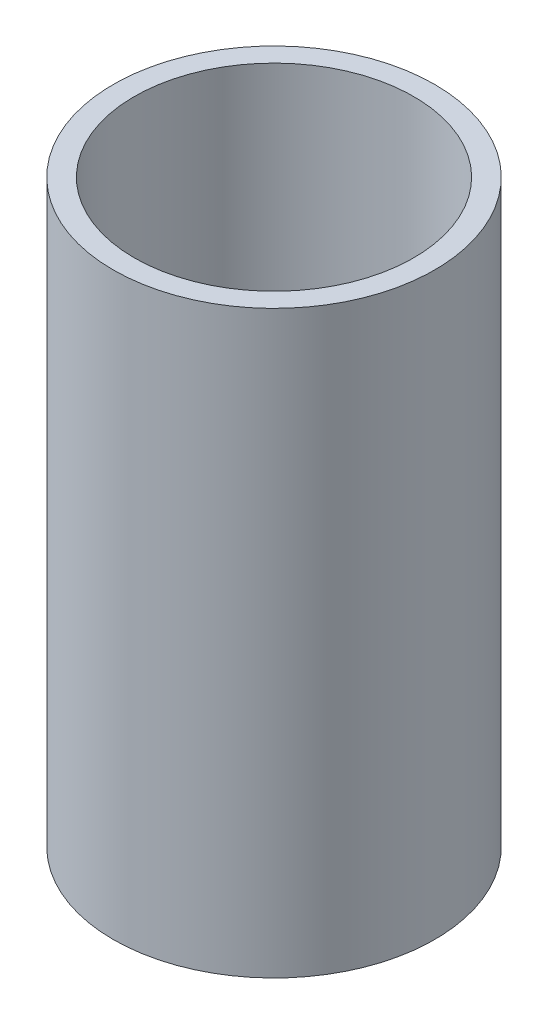
ISO-10303-21;
HEADER;
FILE_DESCRIPTION(('STEP AP214'),'2;1');
FILE_NAME('part.step','',(''),(''),'','','');
FILE_SCHEMA(('AUTOMOTIVE_DESIGN { 1 0 10303 214 1 1 1 1 }'));
ENDSEC;
DATA;
#1=APPLICATION_CONTEXT('core data for automotive mechanical design processes');
#2=APPLICATION_PROTOCOL_DEFINITION('international standard','automotive_design',2000,#1);
#3=PRODUCT_CONTEXT('',#1,'mechanical');
#4=PRODUCT('Part','Part','',(#3));
#5=PRODUCT_RELATED_PRODUCT_CATEGORY('part','',(#4));
#6=PRODUCT_DEFINITION_FORMATION('','',#4);
#7=PRODUCT_DEFINITION_CONTEXT('part definition',#1,'design');
#8=PRODUCT_DEFINITION('design','',#6,#7);
#9=PRODUCT_DEFINITION_SHAPE('','',#8);
#10=(LENGTH_UNIT() NAMED_UNIT(*) SI_UNIT(.MILLI.,.METRE.));
#11=(NAMED_UNIT(*) PLANE_ANGLE_UNIT() SI_UNIT($,.RADIAN.));
#12=(NAMED_UNIT(*) SI_UNIT($,.STERADIAN.) SOLID_ANGLE_UNIT());
#13=UNCERTAINTY_MEASURE_WITH_UNIT(LENGTH_MEASURE(1.E-05),#10,'distance_accuracy_value','');
#14=(GEOMETRIC_REPRESENTATION_CONTEXT(3) GLOBAL_UNCERTAINTY_ASSIGNED_CONTEXT((#13)) GLOBAL_UNIT_ASSIGNED_CONTEXT((#10,
#11,#12)) REPRESENTATION_CONTEXT('',''));
#15=CARTESIAN_POINT('',(0.,0.,0.));
#16=DIRECTION('',(0.,0.,1.));
#17=DIRECTION('',(1.,0.,0.));
#18=AXIS2_PLACEMENT_3D('',#15,#16,#17);
#19=CARTESIAN_POINT('',(0.,40.,0.));
#20=DIRECTION('',(0.,1.,0.));
#21=DIRECTION('',(0.,0.,1.));
#22=AXIS2_PLACEMENT_3D('',#19,#20,#21);
#23=PLANE('',#22);
#24=CARTESIAN_POINT('',(0.,40.,0.));
#25=DIRECTION('',(0.,1.,0.));
#26=DIRECTION('',(0.,0.,1.));
#27=AXIS2_PLACEMENT_3D('',#24,#25,#26);
#28=CIRCLE('',#27,11.5);
#29=CARTESIAN_POINT('',(0.,40.,11.5));
#30=VERTEX_POINT('',#29);
#31=EDGE_CURVE('E10',#30,#30,#28,.T.);
#32=ORIENTED_EDGE('',*,*,#31,.T.);
#33=EDGE_LOOP('',(#32));
#34=FACE_BOUND('',#33,.T.);
#35=CARTESIAN_POINT('',(0.,40.,0.));
#36=DIRECTION('',(0.,1.,0.));
#37=DIRECTION('',(0.,0.,1.));
#38=AXIS2_PLACEMENT_3D('',#35,#36,#37);
#39=CIRCLE('',#38,10.);
#40=CARTESIAN_POINT('',(0.,40.,10.));
#41=VERTEX_POINT('',#40);
#42=EDGE_CURVE('E42',#41,#41,#39,.T.);
#43=ORIENTED_EDGE('',*,*,#42,.F.);
#44=EDGE_LOOP('',(#43));
#45=FACE_BOUND('',#44,.T.);
#46=ADVANCED_FACE('F35',(#34,#45),#23,.T.);
#47=CARTESIAN_POINT('',(0.,40.,0.));
#48=DIRECTION('',(0.,-1.,0.));
#49=DIRECTION('',(0.,0.,-1.));
#50=AXIS2_PLACEMENT_3D('',#47,#48,#49);
#51=CYLINDRICAL_SURFACE('',#50,11.5);
#52=ORIENTED_EDGE('',*,*,#31,.F.);
#53=EDGE_LOOP('',(#52));
#54=FACE_BOUND('',#53,.T.);
#55=CARTESIAN_POINT('',(0.,-1.5,0.));
#56=DIRECTION('',(0.,-1.,0.));
#57=DIRECTION('',(0.,0.,-1.));
#58=AXIS2_PLACEMENT_3D('',#55,#56,#57);
#59=CIRCLE('',#58,11.5);
#60=CARTESIAN_POINT('',(0.,-1.5,-11.5));
#61=VERTEX_POINT('',#60);
#62=EDGE_CURVE('E51',#61,#61,#59,.T.);
#63=ORIENTED_EDGE('',*,*,#62,.F.);
#64=EDGE_LOOP('',(#63));
#65=FACE_BOUND('',#64,.T.);
#66=ADVANCED_FACE('F37',(#54,#65),#51,.T.);
#67=CARTESIAN_POINT('',(0.,40.,0.));
#68=DIRECTION('',(0.,-1.,0.));
#69=DIRECTION('',(0.,0.,-1.));
#70=AXIS2_PLACEMENT_3D('',#67,#68,#69);
#71=CYLINDRICAL_SURFACE('',#70,10.);
#72=ORIENTED_EDGE('',*,*,#42,.T.);
#73=EDGE_LOOP('',(#72));
#74=FACE_BOUND('',#73,.T.);
#75=CARTESIAN_POINT('',(0.,0.,0.));
#76=DIRECTION('',(0.,1.,0.));
#77=DIRECTION('',(0.,0.,1.));
#78=AXIS2_PLACEMENT_3D('',#75,#76,#77);
#79=CIRCLE('',#78,10.);
#80=CARTESIAN_POINT('',(0.,0.,10.));
#81=VERTEX_POINT('',#80);
#82=EDGE_CURVE('E46',#81,#81,#79,.T.);
#83=ORIENTED_EDGE('',*,*,#82,.F.);
#84=EDGE_LOOP('',(#83));
#85=FACE_BOUND('',#84,.T.);
#86=ADVANCED_FACE('F59',(#74,#85),#71,.F.);
#87=CARTESIAN_POINT('',(0.,0.,0.));
#88=DIRECTION('',(0.,-1.,0.));
#89=DIRECTION('',(0.,0.,-1.));
#90=AXIS2_PLACEMENT_3D('',#87,#88,#89);
#91=PLANE('',#90);
#92=ORIENTED_EDGE('',*,*,#82,.T.);
#93=EDGE_LOOP('',(#92));
#94=FACE_BOUND('',#93,.T.);
#95=ADVANCED_FACE('F65',(#94),#91,.F.);
#96=CARTESIAN_POINT('',(0.,-1.5,0.));
#97=DIRECTION('',(0.,-1.,0.));
#98=DIRECTION('',(0.,0.,-1.));
#99=AXIS2_PLACEMENT_3D('',#96,#97,#98);
#100=PLANE('',#99);
#101=ORIENTED_EDGE('',*,*,#62,.T.);
#102=EDGE_LOOP('',(#101));
#103=FACE_BOUND('',#102,.T.);
#104=ADVANCED_FACE('F56',(#103),#100,.T.);
#105=CLOSED_SHELL('',(#46,#66,#86,#95,#104));
#106=MANIFOLD_SOLID_BREP('B2',#105);
#107=ADVANCED_BREP_SHAPE_REPRESENTATION('',(#18,#106),#14);
#108=SHAPE_DEFINITION_REPRESENTATION(#9,#107);
ENDSEC;
END-ISO-10303-21;
